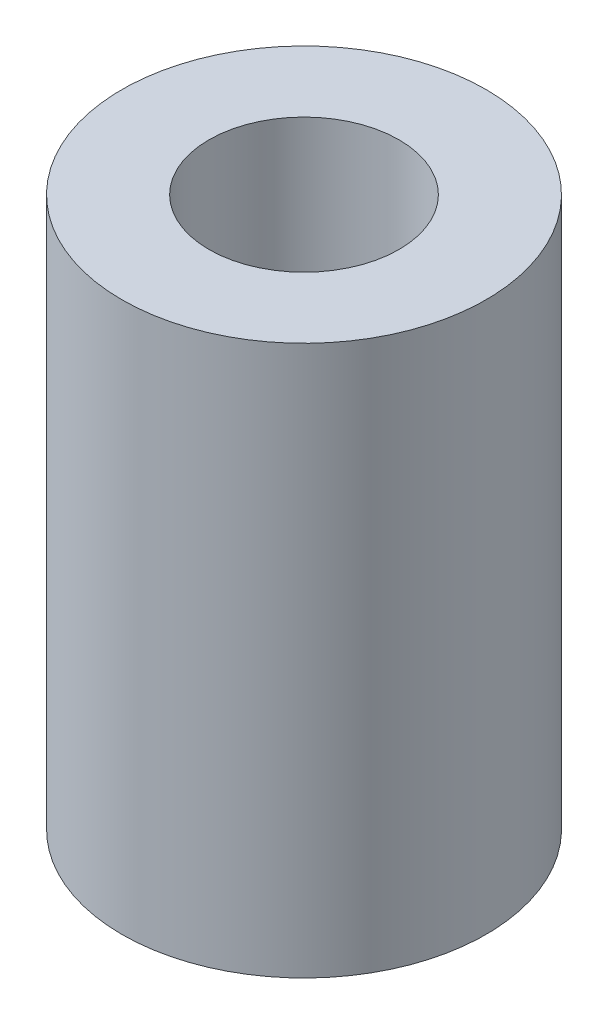
ISO-10303-21;
HEADER;
FILE_DESCRIPTION(('STEP AP214'),'2;1');
FILE_NAME('part.step','',(''),(''),'','','');
FILE_SCHEMA(('AUTOMOTIVE_DESIGN { 1 0 10303 214 1 1 1 1 }'));
ENDSEC;
DATA;
#1=APPLICATION_CONTEXT('core data for automotive mechanical design processes');
#2=APPLICATION_PROTOCOL_DEFINITION('international standard','automotive_design',2000,#1);
#3=PRODUCT_CONTEXT('',#1,'mechanical');
#4=PRODUCT('Part','Part','',(#3));
#5=PRODUCT_RELATED_PRODUCT_CATEGORY('part','',(#4));
#6=PRODUCT_DEFINITION_FORMATION('','',#4);
#7=PRODUCT_DEFINITION_CONTEXT('part definition',#1,'design');
#8=PRODUCT_DEFINITION('design','',#6,#7);
#9=PRODUCT_DEFINITION_SHAPE('','',#8);
#10=(LENGTH_UNIT() NAMED_UNIT(*) SI_UNIT(.MILLI.,.METRE.));
#11=(NAMED_UNIT(*) PLANE_ANGLE_UNIT() SI_UNIT($,.RADIAN.));
#12=(NAMED_UNIT(*) SI_UNIT($,.STERADIAN.) SOLID_ANGLE_UNIT());
#13=UNCERTAINTY_MEASURE_WITH_UNIT(LENGTH_MEASURE(1.E-05),#10,'distance_accuracy_value','');
#14=(GEOMETRIC_REPRESENTATION_CONTEXT(3) GLOBAL_UNCERTAINTY_ASSIGNED_CONTEXT((#13)) GLOBAL_UNIT_ASSIGNED_CONTEXT((#10,
#11,#12)) REPRESENTATION_CONTEXT('',''));
#15=CARTESIAN_POINT('',(0.,0.,0.));
#16=DIRECTION('',(0.,0.,1.));
#17=DIRECTION('',(1.,0.,0.));
#18=AXIS2_PLACEMENT_3D('',#15,#16,#17);
#19=CARTESIAN_POINT('',(0.,12.,0.));
#20=DIRECTION('',(0.,1.,0.));
#21=DIRECTION('',(0.,0.,1.));
#22=AXIS2_PLACEMENT_3D('',#19,#20,#21);
#23=PLANE('',#22);
#24=CARTESIAN_POINT('',(0.,12.,0.));
#25=DIRECTION('',(0.,1.,0.));
#26=DIRECTION('',(0.,0.,1.));
#27=AXIS2_PLACEMENT_3D('',#24,#25,#26);
#28=CIRCLE('',#27,3.975);
#29=CARTESIAN_POINT('',(0.,12.,3.975));
#30=VERTEX_POINT('',#29);
#31=EDGE_CURVE('E10',#30,#30,#28,.T.);
#32=ORIENTED_EDGE('',*,*,#31,.T.);
#33=EDGE_LOOP('',(#32));
#34=FACE_BOUND('',#33,.T.);
#35=CARTESIAN_POINT('',(0.,12.,0.));
#36=DIRECTION('',(0.,1.,0.));
#37=DIRECTION('',(0.,0.,1.));
#38=AXIS2_PLACEMENT_3D('',#35,#36,#37);
#39=CIRCLE('',#38,2.075);
#40=CARTESIAN_POINT('',(0.,12.,2.075));
#41=VERTEX_POINT('',#40);
#42=EDGE_CURVE('E49',#41,#41,#39,.T.);
#43=ORIENTED_EDGE('',*,*,#42,.F.);
#44=EDGE_LOOP('',(#43));
#45=FACE_BOUND('',#44,.T.);
#46=ADVANCED_FACE('F34',(#34,#45),#23,.T.);
#47=CARTESIAN_POINT('',(0.,0.,0.));
#48=DIRECTION('',(0.,1.,0.));
#49=DIRECTION('',(0.,0.,1.));
#50=AXIS2_PLACEMENT_3D('',#47,#48,#49);
#51=PLANE('',#50);
#52=CARTESIAN_POINT('',(0.,0.,0.));
#53=DIRECTION('',(0.,1.,0.));
#54=DIRECTION('',(0.,0.,1.));
#55=AXIS2_PLACEMENT_3D('',#52,#53,#54);
#56=CIRCLE('',#55,3.975);
#57=CARTESIAN_POINT('',(0.,0.,3.975));
#58=VERTEX_POINT('',#57);
#59=EDGE_CURVE('E38',#58,#58,#56,.T.);
#60=ORIENTED_EDGE('',*,*,#59,.F.);
#61=EDGE_LOOP('',(#60));
#62=FACE_BOUND('',#61,.T.);
#63=CARTESIAN_POINT('',(0.,0.,0.));
#64=DIRECTION('',(0.,1.,0.));
#65=DIRECTION('',(0.,0.,1.));
#66=AXIS2_PLACEMENT_3D('',#63,#64,#65);
#67=CIRCLE('',#66,2.075);
#68=CARTESIAN_POINT('',(0.,0.,2.075));
#69=VERTEX_POINT('',#68);
#70=EDGE_CURVE('E51',#69,#69,#67,.T.);
#71=ORIENTED_EDGE('',*,*,#70,.T.);
#72=EDGE_LOOP('',(#71));
#73=FACE_BOUND('',#72,.T.);
#74=ADVANCED_FACE('F61',(#62,#73),#51,.F.);
#75=CARTESIAN_POINT('',(0.,12.,0.));
#76=DIRECTION('',(0.,-1.,0.));
#77=DIRECTION('',(0.,0.,-1.));
#78=AXIS2_PLACEMENT_3D('',#75,#76,#77);
#79=CYLINDRICAL_SURFACE('',#78,3.975);
#80=ORIENTED_EDGE('',*,*,#31,.F.);
#81=EDGE_LOOP('',(#80));
#82=FACE_BOUND('',#81,.T.);
#83=ORIENTED_EDGE('',*,*,#59,.T.);
#84=EDGE_LOOP('',(#83));
#85=FACE_BOUND('',#84,.T.);
#86=ADVANCED_FACE('F36',(#82,#85),#79,.T.);
#87=CARTESIAN_POINT('',(0.,12.,0.));
#88=DIRECTION('',(0.,-1.,0.));
#89=DIRECTION('',(0.,0.,-1.));
#90=AXIS2_PLACEMENT_3D('',#87,#88,#89);
#91=CYLINDRICAL_SURFACE('',#90,2.075);
#92=ORIENTED_EDGE('',*,*,#42,.T.);
#93=EDGE_LOOP('',(#92));
#94=FACE_BOUND('',#93,.T.);
#95=ORIENTED_EDGE('',*,*,#70,.F.);
#96=EDGE_LOOP('',(#95));
#97=FACE_BOUND('',#96,.T.);
#98=ADVANCED_FACE('F57',(#94,#97),#91,.F.);
#99=CLOSED_SHELL('',(#46,#74,#86,#98));
#100=MANIFOLD_SOLID_BREP('B2',#99);
#101=ADVANCED_BREP_SHAPE_REPRESENTATION('',(#18,#100),#14);
#102=SHAPE_DEFINITION_REPRESENTATION(#9,#101);
ENDSEC;
END-ISO-10303-21;
